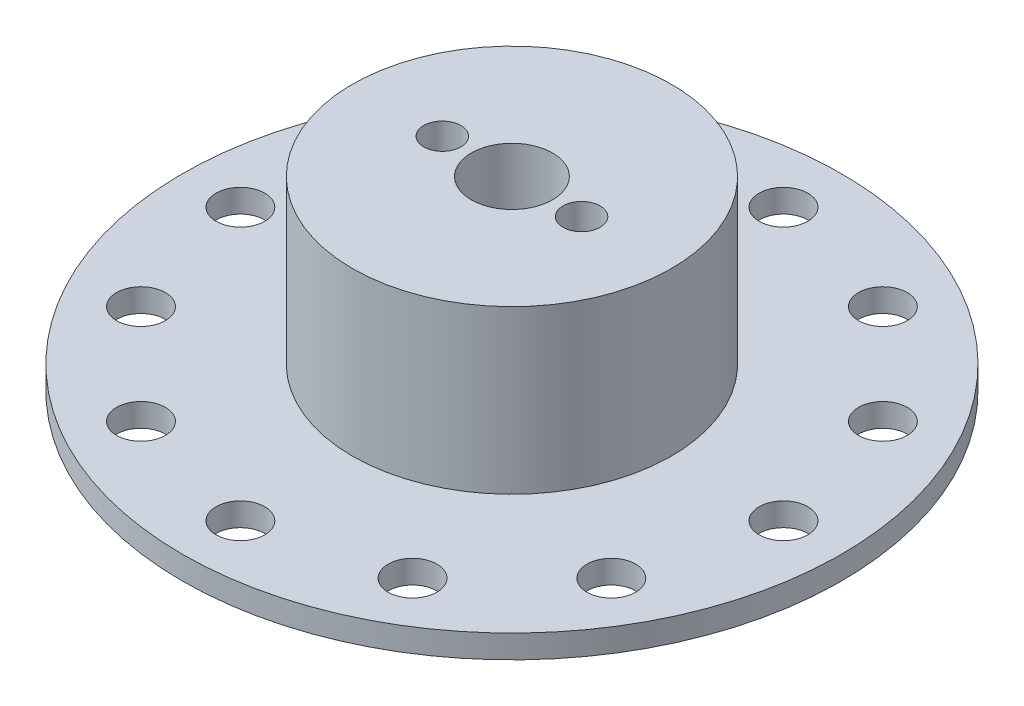
ISO-10303-21;
HEADER;
FILE_DESCRIPTION(('STEP AP214'),'2;1');
FILE_NAME('part.step','',(''),(''),'','','');
FILE_SCHEMA(('AUTOMOTIVE_DESIGN { 1 0 10303 214 1 1 1 1 }'));
ENDSEC;
DATA;
#1=APPLICATION_CONTEXT('core data for automotive mechanical design processes');
#2=APPLICATION_PROTOCOL_DEFINITION('international standard','automotive_design',2000,#1);
#3=PRODUCT_CONTEXT('',#1,'mechanical');
#4=PRODUCT('Part','Part','',(#3));
#5=PRODUCT_RELATED_PRODUCT_CATEGORY('part','',(#4));
#6=PRODUCT_DEFINITION_FORMATION('','',#4);
#7=PRODUCT_DEFINITION_CONTEXT('part definition',#1,'design');
#8=PRODUCT_DEFINITION('design','',#6,#7);
#9=PRODUCT_DEFINITION_SHAPE('','',#8);
#10=(LENGTH_UNIT() NAMED_UNIT(*) SI_UNIT(.MILLI.,.METRE.));
#11=(NAMED_UNIT(*) PLANE_ANGLE_UNIT() SI_UNIT($,.RADIAN.));
#12=(NAMED_UNIT(*) SI_UNIT($,.STERADIAN.) SOLID_ANGLE_UNIT());
#13=UNCERTAINTY_MEASURE_WITH_UNIT(LENGTH_MEASURE(1.E-05),#10,'distance_accuracy_value','');
#14=(GEOMETRIC_REPRESENTATION_CONTEXT(3) GLOBAL_UNCERTAINTY_ASSIGNED_CONTEXT((#13)) GLOBAL_UNIT_ASSIGNED_CONTEXT((#10,
#11,#12)) REPRESENTATION_CONTEXT('',''));
#15=CARTESIAN_POINT('',(0.,0.,0.));
#16=DIRECTION('',(0.,0.,1.));
#17=DIRECTION('',(1.,0.,0.));
#18=AXIS2_PLACEMENT_3D('',#15,#16,#17);
#19=CARTESIAN_POINT('',(0.,2.,0.));
#20=DIRECTION('',(0.,-1.,0.));
#21=DIRECTION('',(0.,0.,-1.));
#22=AXIS2_PLACEMENT_3D('',#19,#20,#21);
#23=CYLINDRICAL_SURFACE('',#22,28.4);
#24=CARTESIAN_POINT('',(0.,2.,0.));
#25=DIRECTION('',(0.,1.,0.));
#26=DIRECTION('',(0.,0.,1.));
#27=AXIS2_PLACEMENT_3D('',#24,#25,#26);
#28=CIRCLE('',#27,28.4);
#29=CARTESIAN_POINT('',(0.,2.,28.4));
#30=VERTEX_POINT('',#29);
#31=EDGE_CURVE('E48',#30,#30,#28,.T.);
#32=ORIENTED_EDGE('',*,*,#31,.F.);
#33=EDGE_LOOP('',(#32));
#34=FACE_BOUND('',#33,.T.);
#35=CARTESIAN_POINT('',(0.,0.,0.));
#36=DIRECTION('',(0.,1.,0.));
#37=DIRECTION('',(0.,0.,1.));
#38=AXIS2_PLACEMENT_3D('',#35,#36,#37);
#39=CIRCLE('',#38,28.4);
#40=CARTESIAN_POINT('',(0.,0.,28.4));
#41=VERTEX_POINT('',#40);
#42=EDGE_CURVE('E43',#41,#41,#39,.T.);
#43=ORIENTED_EDGE('',*,*,#42,.T.);
#44=EDGE_LOOP('',(#43));
#45=FACE_BOUND('',#44,.T.);
#46=ADVANCED_FACE('F40',(#34,#45),#23,.T.);
#47=CARTESIAN_POINT('',(0.,2.,0.));
#48=DIRECTION('',(0.,1.,0.));
#49=DIRECTION('',(0.,0.,1.));
#50=AXIS2_PLACEMENT_3D('',#47,#48,#49);
#51=PLANE('',#50);
#52=CARTESIAN_POINT('',(-20.264994448556,2.,11.6999999999998));
#53=DIRECTION('',(0.,1.,0.));
#54=DIRECTION('',(0.,0.,1.));
#55=AXIS2_PLACEMENT_3D('',#52,#53,#54);
#56=CIRCLE('',#55,2.1);
#57=CARTESIAN_POINT('',(-20.264994448556,2.,13.7999999999998));
#58=VERTEX_POINT('',#57);
#59=EDGE_CURVE('E124',#58,#58,#56,.T.);
#60=ORIENTED_EDGE('',*,*,#59,.F.);
#61=EDGE_LOOP('',(#60));
#62=FACE_BOUND('',#61,.T.);
#63=CARTESIAN_POINT('',(-11.7000000000002,2.,20.2649944485558));
#64=DIRECTION('',(0.,1.,0.));
#65=DIRECTION('',(0.,0.,1.));
#66=AXIS2_PLACEMENT_3D('',#63,#64,#65);
#67=CIRCLE('',#66,2.1);
#68=CARTESIAN_POINT('',(-11.7000000000002,2.,22.3649944485558));
#69=VERTEX_POINT('',#68);
#70=EDGE_CURVE('E133',#69,#69,#67,.T.);
#71=ORIENTED_EDGE('',*,*,#70,.F.);
#72=EDGE_LOOP('',(#71));
#73=FACE_BOUND('',#72,.T.);
#74=CARTESIAN_POINT('',(0.,2.,23.4));
#75=DIRECTION('',(0.,1.,0.));
#76=DIRECTION('',(0.,0.,1.));
#77=AXIS2_PLACEMENT_3D('',#74,#75,#76);
#78=CIRCLE('',#77,2.1);
#79=CARTESIAN_POINT('',(0.,2.,25.5));
#80=VERTEX_POINT('',#79);
#81=EDGE_CURVE('E141',#80,#80,#78,.T.);
#82=ORIENTED_EDGE('',*,*,#81,.F.);
#83=EDGE_LOOP('',(#82));
#84=FACE_BOUND('',#83,.T.);
#85=CARTESIAN_POINT('',(11.6999999999999,2.,20.2649944485559));
#86=DIRECTION('',(0.,1.,0.));
#87=DIRECTION('',(0.,0.,1.));
#88=AXIS2_PLACEMENT_3D('',#85,#86,#87);
#89=CIRCLE('',#88,2.1);
#90=CARTESIAN_POINT('',(11.6999999999999,2.,22.3649944485559));
#91=VERTEX_POINT('',#90);
#92=EDGE_CURVE('E149',#91,#91,#89,.T.);
#93=ORIENTED_EDGE('',*,*,#92,.F.);
#94=EDGE_LOOP('',(#93));
#95=FACE_BOUND('',#94,.T.);
#96=CARTESIAN_POINT('',(20.2649944485558,2.,11.7000000000001));
#97=DIRECTION('',(0.,1.,0.));
#98=DIRECTION('',(0.,0.,1.));
#99=AXIS2_PLACEMENT_3D('',#96,#97,#98);
#100=CIRCLE('',#99,2.1);
#101=CARTESIAN_POINT('',(20.2649944485558,2.,13.8000000000001));
#102=VERTEX_POINT('',#101);
#103=EDGE_CURVE('E92',#102,#102,#100,.T.);
#104=ORIENTED_EDGE('',*,*,#103,.F.);
#105=EDGE_LOOP('',(#104));
#106=FACE_BOUND('',#105,.T.);
#107=CARTESIAN_POINT('',(23.4,2.,0.));
#108=DIRECTION('',(0.,1.,0.));
#109=DIRECTION('',(0.,0.,1.));
#110=AXIS2_PLACEMENT_3D('',#107,#108,#109);
#111=CIRCLE('',#110,2.1);
#112=CARTESIAN_POINT('',(23.4,2.,2.10000000000008));
#113=VERTEX_POINT('',#112);
#114=EDGE_CURVE('E101',#113,#113,#111,.T.);
#115=ORIENTED_EDGE('',*,*,#114,.F.);
#116=EDGE_LOOP('',(#115));
#117=FACE_BOUND('',#116,.T.);
#118=CARTESIAN_POINT('',(20.2649944485559,2.,-11.6999999999999));
#119=DIRECTION('',(0.,1.,0.));
#120=DIRECTION('',(0.,0.,1.));
#121=AXIS2_PLACEMENT_3D('',#118,#119,#120);
#122=CIRCLE('',#121,2.1);
#123=CARTESIAN_POINT('',(20.2649944485559,2.,-9.59999999999995));
#124=VERTEX_POINT('',#123);
#125=EDGE_CURVE('E109',#124,#124,#122,.T.);
#126=ORIENTED_EDGE('',*,*,#125,.F.);
#127=EDGE_LOOP('',(#126));
#128=FACE_BOUND('',#127,.T.);
#129=CARTESIAN_POINT('',(11.7,2.,-20.2649944485558));
#130=DIRECTION('',(0.,1.,0.));
#131=DIRECTION('',(0.,0.,1.));
#132=AXIS2_PLACEMENT_3D('',#129,#130,#131);
#133=CIRCLE('',#132,2.1);
#134=CARTESIAN_POINT('',(11.7,2.,-18.1649944485558));
#135=VERTEX_POINT('',#134);
#136=EDGE_CURVE('E117',#135,#135,#133,.T.);
#137=ORIENTED_EDGE('',*,*,#136,.F.);
#138=EDGE_LOOP('',(#137));
#139=FACE_BOUND('',#138,.T.);
#140=CARTESIAN_POINT('',(-23.4,2.,-2.45101989986788E-13));
#141=DIRECTION('',(0.,1.,0.));
#142=DIRECTION('',(0.,0.,1.));
#143=AXIS2_PLACEMENT_3D('',#140,#141,#142);
#144=CIRCLE('',#143,2.1);
#145=CARTESIAN_POINT('',(-23.4,2.,2.09999999999976));
#146=VERTEX_POINT('',#145);
#147=EDGE_CURVE('E172',#146,#146,#144,.T.);
#148=ORIENTED_EDGE('',*,*,#147,.F.);
#149=EDGE_LOOP('',(#148));
#150=FACE_BOUND('',#149,.T.);
#151=CARTESIAN_POINT('',(-20.2649944485557,2.,-11.7000000000002));
#152=DIRECTION('',(0.,1.,0.));
#153=DIRECTION('',(0.,0.,1.));
#154=AXIS2_PLACEMENT_3D('',#151,#152,#153);
#155=CIRCLE('',#154,2.1);
#156=CARTESIAN_POINT('',(-20.2649944485557,2.,-9.60000000000024));
#157=VERTEX_POINT('',#156);
#158=EDGE_CURVE('E164',#157,#157,#155,.T.);
#159=ORIENTED_EDGE('',*,*,#158,.F.);
#160=EDGE_LOOP('',(#159));
#161=FACE_BOUND('',#160,.T.);
#162=CARTESIAN_POINT('',(-11.6999999999997,2.,-20.264994448556));
#163=DIRECTION('',(0.,1.,0.));
#164=DIRECTION('',(0.,0.,1.));
#165=AXIS2_PLACEMENT_3D('',#162,#163,#164);
#166=CIRCLE('',#165,2.1);
#167=CARTESIAN_POINT('',(-11.6999999999997,2.,-18.164994448556));
#168=VERTEX_POINT('',#167);
#169=EDGE_CURVE('E156',#168,#168,#166,.T.);
#170=ORIENTED_EDGE('',*,*,#169,.F.);
#171=EDGE_LOOP('',(#170));
#172=FACE_BOUND('',#171,.T.);
#173=CARTESIAN_POINT('',(0.,2.,-23.4));
#174=DIRECTION('',(0.,1.,0.));
#175=DIRECTION('',(0.,0.,1.));
#176=AXIS2_PLACEMENT_3D('',#173,#174,#175);
#177=CIRCLE('',#176,2.1);
#178=CARTESIAN_POINT('',(0.,2.,-21.3));
#179=VERTEX_POINT('',#178);
#180=EDGE_CURVE('E84',#179,#179,#177,.T.);
#181=ORIENTED_EDGE('',*,*,#180,.F.);
#182=EDGE_LOOP('',(#181));
#183=FACE_BOUND('',#182,.T.);
#184=CARTESIAN_POINT('',(0.,2.,0.));
#185=DIRECTION('',(0.,1.,0.));
#186=DIRECTION('',(0.,0.,1.));
#187=AXIS2_PLACEMENT_3D('',#184,#185,#186);
#188=CIRCLE('',#187,13.75);
#189=CARTESIAN_POINT('',(0.,2.,13.75));
#190=VERTEX_POINT('',#189);
#191=EDGE_CURVE('E10',#190,#190,#188,.T.);
#192=ORIENTED_EDGE('',*,*,#191,.F.);
#193=EDGE_LOOP('',(#192));
#194=FACE_BOUND('',#193,.T.);
#195=ORIENTED_EDGE('',*,*,#31,.T.);
#196=EDGE_LOOP('',(#195));
#197=FACE_BOUND('',#196,.T.);
#198=ADVANCED_FACE('F191',(#62,#73,#84,#95,#106,#117,#128,#139,#150,#161,#172,#183,#194,#197),
#51,.T.);
#199=CARTESIAN_POINT('',(0.,0.,0.));
#200=DIRECTION('',(0.,1.,0.));
#201=DIRECTION('',(0.,0.,1.));
#202=AXIS2_PLACEMENT_3D('',#199,#200,#201);
#203=PLANE('',#202);
#204=CARTESIAN_POINT('',(-20.264994448556,0.,11.6999999999998));
#205=DIRECTION('',(0.,1.,0.));
#206=DIRECTION('',(0.,0.,1.));
#207=AXIS2_PLACEMENT_3D('',#204,#205,#206);
#208=CIRCLE('',#207,2.1);
#209=CARTESIAN_POINT('',(-20.264994448556,0.,13.7999999999998));
#210=VERTEX_POINT('',#209);
#211=EDGE_CURVE('E128',#210,#210,#208,.T.);
#212=ORIENTED_EDGE('',*,*,#211,.T.);
#213=EDGE_LOOP('',(#212));
#214=FACE_BOUND('',#213,.T.);
#215=CARTESIAN_POINT('',(-11.7000000000002,0.,20.2649944485558));
#216=DIRECTION('',(0.,1.,0.));
#217=DIRECTION('',(0.,0.,1.));
#218=AXIS2_PLACEMENT_3D('',#215,#216,#217);
#219=CIRCLE('',#218,2.1);
#220=CARTESIAN_POINT('',(-11.7000000000002,0.,22.3649944485558));
#221=VERTEX_POINT('',#220);
#222=EDGE_CURVE('E137',#221,#221,#219,.T.);
#223=ORIENTED_EDGE('',*,*,#222,.T.);
#224=EDGE_LOOP('',(#223));
#225=FACE_BOUND('',#224,.T.);
#226=CARTESIAN_POINT('',(0.,0.,23.4));
#227=DIRECTION('',(0.,1.,0.));
#228=DIRECTION('',(0.,0.,1.));
#229=AXIS2_PLACEMENT_3D('',#226,#227,#228);
#230=CIRCLE('',#229,2.1);
#231=CARTESIAN_POINT('',(0.,0.,25.5));
#232=VERTEX_POINT('',#231);
#233=EDGE_CURVE('E145',#232,#232,#230,.T.);
#234=ORIENTED_EDGE('',*,*,#233,.T.);
#235=EDGE_LOOP('',(#234));
#236=FACE_BOUND('',#235,.T.);
#237=CARTESIAN_POINT('',(11.6999999999999,0.,20.2649944485559));
#238=DIRECTION('',(0.,1.,0.));
#239=DIRECTION('',(0.,0.,1.));
#240=AXIS2_PLACEMENT_3D('',#237,#238,#239);
#241=CIRCLE('',#240,2.1);
#242=CARTESIAN_POINT('',(11.6999999999999,0.,22.3649944485559));
#243=VERTEX_POINT('',#242);
#244=EDGE_CURVE('E97',#243,#243,#241,.T.);
#245=ORIENTED_EDGE('',*,*,#244,.T.);
#246=EDGE_LOOP('',(#245));
#247=FACE_BOUND('',#246,.T.);
#248=CARTESIAN_POINT('',(20.2649944485558,0.,11.7000000000001));
#249=DIRECTION('',(0.,1.,0.));
#250=DIRECTION('',(0.,0.,1.));
#251=AXIS2_PLACEMENT_3D('',#248,#249,#250);
#252=CIRCLE('',#251,2.1);
#253=CARTESIAN_POINT('',(20.2649944485558,0.,13.8000000000001));
#254=VERTEX_POINT('',#253);
#255=EDGE_CURVE('E96',#254,#254,#252,.T.);
#256=ORIENTED_EDGE('',*,*,#255,.T.);
#257=EDGE_LOOP('',(#256));
#258=FACE_BOUND('',#257,.T.);
#259=CARTESIAN_POINT('',(23.4,0.,0.));
#260=DIRECTION('',(0.,1.,0.));
#261=DIRECTION('',(0.,0.,1.));
#262=AXIS2_PLACEMENT_3D('',#259,#260,#261);
#263=CIRCLE('',#262,2.1);
#264=CARTESIAN_POINT('',(23.4,0.,2.10000000000008));
#265=VERTEX_POINT('',#264);
#266=EDGE_CURVE('E105',#265,#265,#263,.T.);
#267=ORIENTED_EDGE('',*,*,#266,.T.);
#268=EDGE_LOOP('',(#267));
#269=FACE_BOUND('',#268,.T.);
#270=CARTESIAN_POINT('',(20.2649944485559,0.,-11.6999999999999));
#271=DIRECTION('',(0.,1.,0.));
#272=DIRECTION('',(0.,0.,1.));
#273=AXIS2_PLACEMENT_3D('',#270,#271,#272);
#274=CIRCLE('',#273,2.1);
#275=CARTESIAN_POINT('',(20.2649944485559,0.,-9.59999999999995));
#276=VERTEX_POINT('',#275);
#277=EDGE_CURVE('E113',#276,#276,#274,.T.);
#278=ORIENTED_EDGE('',*,*,#277,.T.);
#279=EDGE_LOOP('',(#278));
#280=FACE_BOUND('',#279,.T.);
#281=CARTESIAN_POINT('',(11.7,0.,-20.2649944485558));
#282=DIRECTION('',(0.,1.,0.));
#283=DIRECTION('',(0.,0.,1.));
#284=AXIS2_PLACEMENT_3D('',#281,#282,#283);
#285=CIRCLE('',#284,2.1);
#286=CARTESIAN_POINT('',(11.7,0.,-18.1649944485558));
#287=VERTEX_POINT('',#286);
#288=EDGE_CURVE('E88',#287,#287,#285,.T.);
#289=ORIENTED_EDGE('',*,*,#288,.T.);
#290=EDGE_LOOP('',(#289));
#291=FACE_BOUND('',#290,.T.);
#292=CARTESIAN_POINT('',(-23.4,0.,-2.45101989986788E-13));
#293=DIRECTION('',(0.,1.,0.));
#294=DIRECTION('',(0.,0.,1.));
#295=AXIS2_PLACEMENT_3D('',#292,#293,#294);
#296=CIRCLE('',#295,2.1);
#297=CARTESIAN_POINT('',(-23.4,0.,2.09999999999976));
#298=VERTEX_POINT('',#297);
#299=EDGE_CURVE('E129',#298,#298,#296,.T.);
#300=ORIENTED_EDGE('',*,*,#299,.T.);
#301=EDGE_LOOP('',(#300));
#302=FACE_BOUND('',#301,.T.);
#303=CARTESIAN_POINT('',(-20.2649944485557,0.,-11.7000000000002));
#304=DIRECTION('',(0.,1.,0.));
#305=DIRECTION('',(0.,0.,1.));
#306=AXIS2_PLACEMENT_3D('',#303,#304,#305);
#307=CIRCLE('',#306,2.1);
#308=CARTESIAN_POINT('',(-20.2649944485557,0.,-9.60000000000024));
#309=VERTEX_POINT('',#308);
#310=EDGE_CURVE('E168',#309,#309,#307,.T.);
#311=ORIENTED_EDGE('',*,*,#310,.T.);
#312=EDGE_LOOP('',(#311));
#313=FACE_BOUND('',#312,.T.);
#314=CARTESIAN_POINT('',(-11.6999999999997,0.,-20.264994448556));
#315=DIRECTION('',(0.,1.,0.));
#316=DIRECTION('',(0.,0.,1.));
#317=AXIS2_PLACEMENT_3D('',#314,#315,#316);
#318=CIRCLE('',#317,2.1);
#319=CARTESIAN_POINT('',(-11.6999999999997,0.,-18.164994448556));
#320=VERTEX_POINT('',#319);
#321=EDGE_CURVE('E160',#320,#320,#318,.T.);
#322=ORIENTED_EDGE('',*,*,#321,.T.);
#323=EDGE_LOOP('',(#322));
#324=FACE_BOUND('',#323,.T.);
#325=CARTESIAN_POINT('',(0.,0.,-23.4));
#326=DIRECTION('',(0.,1.,0.));
#327=DIRECTION('',(0.,0.,1.));
#328=AXIS2_PLACEMENT_3D('',#325,#326,#327);
#329=CIRCLE('',#328,2.1);
#330=CARTESIAN_POINT('',(0.,0.,-21.3));
#331=VERTEX_POINT('',#330);
#332=EDGE_CURVE('E73',#331,#331,#329,.T.);
#333=ORIENTED_EDGE('',*,*,#332,.T.);
#334=EDGE_LOOP('',(#333));
#335=FACE_BOUND('',#334,.T.);
#336=CARTESIAN_POINT('',(6.,0.,0.));
#337=DIRECTION('',(0.,1.,0.));
#338=DIRECTION('',(0.,0.,1.));
#339=AXIS2_PLACEMENT_3D('',#336,#337,#338);
#340=CIRCLE('',#339,1.6);
#341=CARTESIAN_POINT('',(6.,0.,1.6));
#342=VERTEX_POINT('',#341);
#343=EDGE_CURVE('E68',#342,#342,#340,.T.);
#344=ORIENTED_EDGE('',*,*,#343,.T.);
#345=EDGE_LOOP('',(#344));
#346=FACE_BOUND('',#345,.T.);
#347=CARTESIAN_POINT('',(-6.,0.,0.));
#348=DIRECTION('',(0.,1.,0.));
#349=DIRECTION('',(0.,0.,1.));
#350=AXIS2_PLACEMENT_3D('',#347,#348,#349);
#351=CIRCLE('',#350,1.6);
#352=CARTESIAN_POINT('',(-6.,0.,1.6));
#353=VERTEX_POINT('',#352);
#354=EDGE_CURVE('E77',#353,#353,#351,.T.);
#355=ORIENTED_EDGE('',*,*,#354,.T.);
#356=EDGE_LOOP('',(#355));
#357=FACE_BOUND('',#356,.T.);
#358=CARTESIAN_POINT('',(0.,0.,0.));
#359=DIRECTION('',(0.,1.,0.));
#360=DIRECTION('',(0.,0.,1.));
#361=AXIS2_PLACEMENT_3D('',#358,#359,#360);
#362=CIRCLE('',#361,3.5);
#363=CARTESIAN_POINT('',(0.,0.,3.5));
#364=VERTEX_POINT('',#363);
#365=EDGE_CURVE('E59',#364,#364,#362,.T.);
#366=ORIENTED_EDGE('',*,*,#365,.T.);
#367=EDGE_LOOP('',(#366));
#368=FACE_BOUND('',#367,.T.);
#369=ORIENTED_EDGE('',*,*,#42,.F.);
#370=EDGE_LOOP('',(#369));
#371=FACE_BOUND('',#370,.T.);
#372=ADVANCED_FACE('F180',(#214,#225,#236,#247,#258,#269,#280,#291,#302,#313,#324,#335,#346,
#357,#368,#371),#203,.F.);
#373=CARTESIAN_POINT('',(0.,16.,0.));
#374=DIRECTION('',(0.,-1.,0.));
#375=DIRECTION('',(0.,0.,-1.));
#376=AXIS2_PLACEMENT_3D('',#373,#374,#375);
#377=CYLINDRICAL_SURFACE('',#376,13.75);
#378=CARTESIAN_POINT('',(0.,16.,0.));
#379=DIRECTION('',(0.,1.,0.));
#380=DIRECTION('',(0.,0.,1.));
#381=AXIS2_PLACEMENT_3D('',#378,#379,#380);
#382=CIRCLE('',#381,13.75);
#383=CARTESIAN_POINT('',(0.,16.,13.75));
#384=VERTEX_POINT('',#383);
#385=EDGE_CURVE('E55',#384,#384,#382,.T.);
#386=ORIENTED_EDGE('',*,*,#385,.F.);
#387=EDGE_LOOP('',(#386));
#388=FACE_BOUND('',#387,.T.);
#389=ORIENTED_EDGE('',*,*,#191,.T.);
#390=EDGE_LOOP('',(#389));
#391=FACE_BOUND('',#390,.T.);
#392=ADVANCED_FACE('F212',(#388,#391),#377,.T.);
#393=CARTESIAN_POINT('',(0.,16.,0.));
#394=DIRECTION('',(0.,1.,0.));
#395=DIRECTION('',(0.,0.,1.));
#396=AXIS2_PLACEMENT_3D('',#393,#394,#395);
#397=PLANE('',#396);
#398=CARTESIAN_POINT('',(6.,16.,0.));
#399=DIRECTION('',(0.,1.,0.));
#400=DIRECTION('',(0.,0.,1.));
#401=AXIS2_PLACEMENT_3D('',#398,#399,#400);
#402=CIRCLE('',#401,1.6);
#403=CARTESIAN_POINT('',(6.,16.,1.6));
#404=VERTEX_POINT('',#403);
#405=EDGE_CURVE('E72',#404,#404,#402,.T.);
#406=ORIENTED_EDGE('',*,*,#405,.F.);
#407=EDGE_LOOP('',(#406));
#408=FACE_BOUND('',#407,.T.);
#409=CARTESIAN_POINT('',(-6.,16.,0.));
#410=DIRECTION('',(0.,1.,0.));
#411=DIRECTION('',(0.,0.,1.));
#412=AXIS2_PLACEMENT_3D('',#409,#410,#411);
#413=CIRCLE('',#412,1.6);
#414=CARTESIAN_POINT('',(-6.,16.,1.6));
#415=VERTEX_POINT('',#414);
#416=EDGE_CURVE('E64',#415,#415,#413,.T.);
#417=ORIENTED_EDGE('',*,*,#416,.F.);
#418=EDGE_LOOP('',(#417));
#419=FACE_BOUND('',#418,.T.);
#420=CARTESIAN_POINT('',(0.,16.,0.));
#421=DIRECTION('',(0.,1.,0.));
#422=DIRECTION('',(0.,0.,1.));
#423=AXIS2_PLACEMENT_3D('',#420,#421,#422);
#424=CIRCLE('',#423,3.5);
#425=CARTESIAN_POINT('',(0.,16.,3.5));
#426=VERTEX_POINT('',#425);
#427=EDGE_CURVE('E60',#426,#426,#424,.T.);
#428=ORIENTED_EDGE('',*,*,#427,.F.);
#429=EDGE_LOOP('',(#428));
#430=FACE_BOUND('',#429,.T.);
#431=ORIENTED_EDGE('',*,*,#385,.T.);
#432=EDGE_LOOP('',(#431));
#433=FACE_BOUND('',#432,.T.);
#434=ADVANCED_FACE('F217',(#408,#419,#430,#433),#397,.T.);
#435=CARTESIAN_POINT('',(0.,0.,0.));
#436=DIRECTION('',(0.,1.,0.));
#437=DIRECTION('',(0.,0.,1.));
#438=AXIS2_PLACEMENT_3D('',#435,#436,#437);
#439=CYLINDRICAL_SURFACE('',#438,3.5);
#440=ORIENTED_EDGE('',*,*,#365,.F.);
#441=EDGE_LOOP('',(#440));
#442=FACE_BOUND('',#441,.T.);
#443=ORIENTED_EDGE('',*,*,#427,.T.);
#444=EDGE_LOOP('',(#443));
#445=FACE_BOUND('',#444,.T.);
#446=ADVANCED_FACE('F224',(#442,#445),#439,.F.);
#447=CARTESIAN_POINT('',(-6.,0.,0.));
#448=DIRECTION('',(0.,1.,0.));
#449=DIRECTION('',(0.,0.,1.));
#450=AXIS2_PLACEMENT_3D('',#447,#448,#449);
#451=CYLINDRICAL_SURFACE('',#450,1.6);
#452=ORIENTED_EDGE('',*,*,#354,.F.);
#453=EDGE_LOOP('',(#452));
#454=FACE_BOUND('',#453,.T.);
#455=ORIENTED_EDGE('',*,*,#416,.T.);
#456=EDGE_LOOP('',(#455));
#457=FACE_BOUND('',#456,.T.);
#458=ADVANCED_FACE('F228',(#454,#457),#451,.F.);
#459=CARTESIAN_POINT('',(6.,0.,0.));
#460=DIRECTION('',(0.,1.,0.));
#461=DIRECTION('',(0.,0.,1.));
#462=AXIS2_PLACEMENT_3D('',#459,#460,#461);
#463=CYLINDRICAL_SURFACE('',#462,1.6);
#464=ORIENTED_EDGE('',*,*,#343,.F.);
#465=EDGE_LOOP('',(#464));
#466=FACE_BOUND('',#465,.T.);
#467=ORIENTED_EDGE('',*,*,#405,.T.);
#468=EDGE_LOOP('',(#467));
#469=FACE_BOUND('',#468,.T.);
#470=ADVANCED_FACE('F230',(#466,#469),#463,.F.);
#471=CARTESIAN_POINT('',(0.,0.,-23.4));
#472=DIRECTION('',(0.,1.,0.));
#473=DIRECTION('',(0.,0.,1.));
#474=AXIS2_PLACEMENT_3D('',#471,#472,#473);
#475=CYLINDRICAL_SURFACE('',#474,2.1);
#476=ORIENTED_EDGE('',*,*,#332,.F.);
#477=EDGE_LOOP('',(#476));
#478=FACE_BOUND('',#477,.T.);
#479=ORIENTED_EDGE('',*,*,#180,.T.);
#480=EDGE_LOOP('',(#479));
#481=FACE_BOUND('',#480,.T.);
#482=ADVANCED_FACE('F233',(#478,#481),#475,.F.);
#483=CARTESIAN_POINT('',(-11.6999999999997,0.,-20.264994448556));
#484=DIRECTION('',(0.,1.,0.));
#485=DIRECTION('',(0.,0.,1.));
#486=AXIS2_PLACEMENT_3D('',#483,#484,#485);
#487=CYLINDRICAL_SURFACE('',#486,2.1);
#488=ORIENTED_EDGE('',*,*,#321,.F.);
#489=EDGE_LOOP('',(#488));
#490=FACE_BOUND('',#489,.T.);
#491=ORIENTED_EDGE('',*,*,#169,.T.);
#492=EDGE_LOOP('',(#491));
#493=FACE_BOUND('',#492,.T.);
#494=ADVANCED_FACE('F240',(#490,#493),#487,.F.);
#495=CARTESIAN_POINT('',(-20.2649944485557,0.,-11.7000000000002));
#496=DIRECTION('',(0.,1.,0.));
#497=DIRECTION('',(0.,0.,1.));
#498=AXIS2_PLACEMENT_3D('',#495,#496,#497);
#499=CYLINDRICAL_SURFACE('',#498,2.1);
#500=ORIENTED_EDGE('',*,*,#310,.F.);
#501=EDGE_LOOP('',(#500));
#502=FACE_BOUND('',#501,.T.);
#503=ORIENTED_EDGE('',*,*,#158,.T.);
#504=EDGE_LOOP('',(#503));
#505=FACE_BOUND('',#504,.T.);
#506=ADVANCED_FACE('F187',(#502,#505),#499,.F.);
#507=CARTESIAN_POINT('',(-23.4,0.,-2.45101989986788E-13));
#508=DIRECTION('',(0.,1.,0.));
#509=DIRECTION('',(0.,0.,1.));
#510=AXIS2_PLACEMENT_3D('',#507,#508,#509);
#511=CYLINDRICAL_SURFACE('',#510,2.1);
#512=ORIENTED_EDGE('',*,*,#299,.F.);
#513=EDGE_LOOP('',(#512));
#514=FACE_BOUND('',#513,.T.);
#515=ORIENTED_EDGE('',*,*,#147,.T.);
#516=EDGE_LOOP('',(#515));
#517=FACE_BOUND('',#516,.T.);
#518=ADVANCED_FACE('F183',(#514,#517),#511,.F.);
#519=CARTESIAN_POINT('',(11.7,0.,-20.2649944485558));
#520=DIRECTION('',(0.,1.,0.));
#521=DIRECTION('',(0.,0.,1.));
#522=AXIS2_PLACEMENT_3D('',#519,#520,#521);
#523=CYLINDRICAL_SURFACE('',#522,2.1);
#524=ORIENTED_EDGE('',*,*,#288,.F.);
#525=EDGE_LOOP('',(#524));
#526=FACE_BOUND('',#525,.T.);
#527=ORIENTED_EDGE('',*,*,#136,.T.);
#528=EDGE_LOOP('',(#527));
#529=FACE_BOUND('',#528,.T.);
#530=ADVANCED_FACE('F186',(#526,#529),#523,.F.);
#531=CARTESIAN_POINT('',(20.2649944485559,0.,-11.6999999999999));
#532=DIRECTION('',(0.,1.,0.));
#533=DIRECTION('',(0.,0.,1.));
#534=AXIS2_PLACEMENT_3D('',#531,#532,#533);
#535=CYLINDRICAL_SURFACE('',#534,2.1);
#536=ORIENTED_EDGE('',*,*,#277,.F.);
#537=EDGE_LOOP('',(#536));
#538=FACE_BOUND('',#537,.T.);
#539=ORIENTED_EDGE('',*,*,#125,.T.);
#540=EDGE_LOOP('',(#539));
#541=FACE_BOUND('',#540,.T.);
#542=ADVANCED_FACE('F250',(#538,#541),#535,.F.);
#543=CARTESIAN_POINT('',(23.4,0.,0.));
#544=DIRECTION('',(0.,1.,0.));
#545=DIRECTION('',(0.,0.,1.));
#546=AXIS2_PLACEMENT_3D('',#543,#544,#545);
#547=CYLINDRICAL_SURFACE('',#546,2.1);
#548=ORIENTED_EDGE('',*,*,#266,.F.);
#549=EDGE_LOOP('',(#548));
#550=FACE_BOUND('',#549,.T.);
#551=ORIENTED_EDGE('',*,*,#114,.T.);
#552=EDGE_LOOP('',(#551));
#553=FACE_BOUND('',#552,.T.);
#554=ADVANCED_FACE('F246',(#550,#553),#547,.F.);
#555=CARTESIAN_POINT('',(20.2649944485558,0.,11.7000000000001));
#556=DIRECTION('',(0.,1.,0.));
#557=DIRECTION('',(0.,0.,1.));
#558=AXIS2_PLACEMENT_3D('',#555,#556,#557);
#559=CYLINDRICAL_SURFACE('',#558,2.1);
#560=ORIENTED_EDGE('',*,*,#255,.F.);
#561=EDGE_LOOP('',(#560));
#562=FACE_BOUND('',#561,.T.);
#563=ORIENTED_EDGE('',*,*,#103,.T.);
#564=EDGE_LOOP('',(#563));
#565=FACE_BOUND('',#564,.T.);
#566=ADVANCED_FACE('F242',(#562,#565),#559,.F.);
#567=CARTESIAN_POINT('',(11.6999999999999,0.,20.2649944485559));
#568=DIRECTION('',(0.,1.,0.));
#569=DIRECTION('',(0.,0.,1.));
#570=AXIS2_PLACEMENT_3D('',#567,#568,#569);
#571=CYLINDRICAL_SURFACE('',#570,2.1);
#572=ORIENTED_EDGE('',*,*,#244,.F.);
#573=EDGE_LOOP('',(#572));
#574=FACE_BOUND('',#573,.T.);
#575=ORIENTED_EDGE('',*,*,#92,.T.);
#576=EDGE_LOOP('',(#575));
#577=FACE_BOUND('',#576,.T.);
#578=ADVANCED_FACE('F245',(#574,#577),#571,.F.);
#579=CARTESIAN_POINT('',(0.,0.,23.4));
#580=DIRECTION('',(0.,1.,0.));
#581=DIRECTION('',(0.,0.,1.));
#582=AXIS2_PLACEMENT_3D('',#579,#580,#581);
#583=CYLINDRICAL_SURFACE('',#582,2.1);
#584=ORIENTED_EDGE('',*,*,#233,.F.);
#585=EDGE_LOOP('',(#584));
#586=FACE_BOUND('',#585,.T.);
#587=ORIENTED_EDGE('',*,*,#81,.T.);
#588=EDGE_LOOP('',(#587));
#589=FACE_BOUND('',#588,.T.);
#590=ADVANCED_FACE('F265',(#586,#589),#583,.F.);
#591=CARTESIAN_POINT('',(-11.7000000000002,0.,20.2649944485558));
#592=DIRECTION('',(0.,1.,0.));
#593=DIRECTION('',(0.,0.,1.));
#594=AXIS2_PLACEMENT_3D('',#591,#592,#593);
#595=CYLINDRICAL_SURFACE('',#594,2.1);
#596=ORIENTED_EDGE('',*,*,#222,.F.);
#597=EDGE_LOOP('',(#596));
#598=FACE_BOUND('',#597,.T.);
#599=ORIENTED_EDGE('',*,*,#70,.T.);
#600=EDGE_LOOP('',(#599));
#601=FACE_BOUND('',#600,.T.);
#602=ADVANCED_FACE('F261',(#598,#601),#595,.F.);
#603=CARTESIAN_POINT('',(-20.264994448556,0.,11.6999999999998));
#604=DIRECTION('',(0.,1.,0.));
#605=DIRECTION('',(0.,0.,1.));
#606=AXIS2_PLACEMENT_3D('',#603,#604,#605);
#607=CYLINDRICAL_SURFACE('',#606,2.1);
#608=ORIENTED_EDGE('',*,*,#211,.F.);
#609=EDGE_LOOP('',(#608));
#610=FACE_BOUND('',#609,.T.);
#611=ORIENTED_EDGE('',*,*,#59,.T.);
#612=EDGE_LOOP('',(#611));
#613=FACE_BOUND('',#612,.T.);
#614=ADVANCED_FACE('F258',(#610,#613),#607,.F.);
#615=CLOSED_SHELL('',(#46,#198,#372,#392,#434,#446,#458,#470,#482,#494,#506,#518,#530,#542,#554,
#566,#578,#590,#602,#614));
#616=MANIFOLD_SOLID_BREP('B2',#615);
#617=ADVANCED_BREP_SHAPE_REPRESENTATION('',(#18,#616),#14);
#618=SHAPE_DEFINITION_REPRESENTATION(#9,#617);
ENDSEC;
END-ISO-10303-21;
